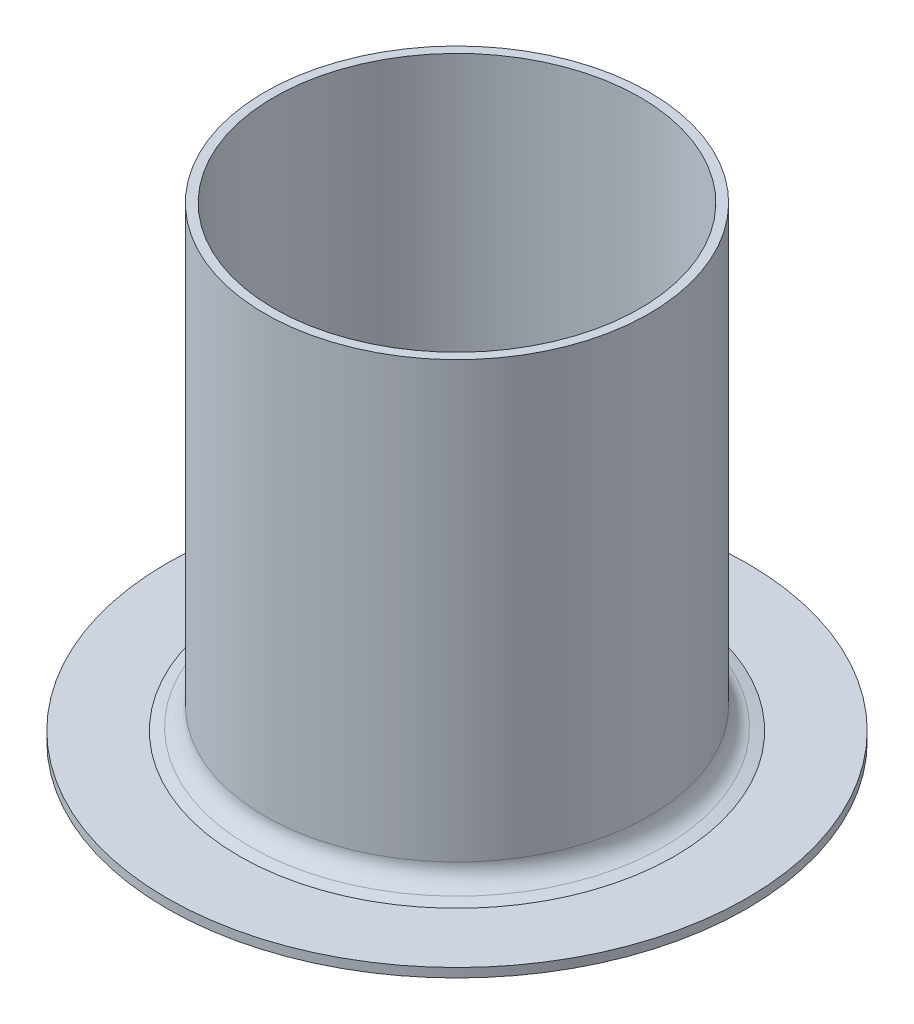
ISO-10303-21;
HEADER;
FILE_DESCRIPTION(('STEP AP214'),'2;1');
FILE_NAME('part.step','',(''),(''),'','','');
FILE_SCHEMA(('AUTOMOTIVE_DESIGN { 1 0 10303 214 1 1 1 1 }'));
ENDSEC;
DATA;
#1=APPLICATION_CONTEXT('core data for automotive mechanical design processes');
#2=APPLICATION_PROTOCOL_DEFINITION('international standard','automotive_design',2000,#1);
#3=PRODUCT_CONTEXT('',#1,'mechanical');
#4=PRODUCT('Part','Part','',(#3));
#5=PRODUCT_RELATED_PRODUCT_CATEGORY('part','',(#4));
#6=PRODUCT_DEFINITION_FORMATION('','',#4);
#7=PRODUCT_DEFINITION_CONTEXT('part definition',#1,'design');
#8=PRODUCT_DEFINITION('design','',#6,#7);
#9=PRODUCT_DEFINITION_SHAPE('','',#8);
#10=(LENGTH_UNIT() NAMED_UNIT(*) SI_UNIT(.MILLI.,.METRE.));
#11=(NAMED_UNIT(*) PLANE_ANGLE_UNIT() SI_UNIT($,.RADIAN.));
#12=(NAMED_UNIT(*) SI_UNIT($,.STERADIAN.) SOLID_ANGLE_UNIT());
#13=UNCERTAINTY_MEASURE_WITH_UNIT(LENGTH_MEASURE(1.E-05),#10,'distance_accuracy_value','');
#14=(GEOMETRIC_REPRESENTATION_CONTEXT(3) GLOBAL_UNCERTAINTY_ASSIGNED_CONTEXT((#13)) GLOBAL_UNIT_ASSIGNED_CONTEXT((#10,
#11,#12)) REPRESENTATION_CONTEXT('',''));
#15=CARTESIAN_POINT('',(0.,0.,0.));
#16=DIRECTION('',(0.,0.,1.));
#17=DIRECTION('',(1.,0.,0.));
#18=AXIS2_PLACEMENT_3D('',#15,#16,#17);
#19=CARTESIAN_POINT('',(0.,1.5875,0.));
#20=DIRECTION('',(0.,-1.,0.));
#21=DIRECTION('',(0.,0.,-1.));
#22=AXIS2_PLACEMENT_3D('',#19,#20,#21);
#23=CONICAL_SURFACE('',#22,38.1,1.30899693899575);
#24=CARTESIAN_POINT('',(0.,2.09208202372315,0.));
#25=DIRECTION('',(0.,-1.,0.));
#26=DIRECTION('',(0.,0.,-1.));
#27=AXIS2_PLACEMENT_3D('',#24,#25,#26);
#28=CIRCLE('',#27,36.2168742508792);
#29=CARTESIAN_POINT('',(0.,2.09208202372315,-36.2168742508792));
#30=VERTEX_POINT('',#29);
#31=EDGE_CURVE('E10',#30,#30,#28,.T.);
#32=ORIENTED_EDGE('',*,*,#31,.T.);
#33=EDGE_LOOP('',(#32));
#34=FACE_BOUND('',#33,.T.);
#35=CARTESIAN_POINT('',(0.,1.5875,0.));
#36=DIRECTION('',(0.,-1.,0.));
#37=DIRECTION('',(0.,0.,-1.));
#38=AXIS2_PLACEMENT_3D('',#35,#36,#37);
#39=CIRCLE('',#38,38.1);
#40=CARTESIAN_POINT('',(0.,1.5875,-38.1));
#41=VERTEX_POINT('',#40);
#42=EDGE_CURVE('E86',#41,#41,#39,.T.);
#43=ORIENTED_EDGE('',*,*,#42,.F.);
#44=EDGE_LOOP('',(#43));
#45=FACE_BOUND('',#44,.T.);
#46=ADVANCED_FACE('F43',(#34,#45),#23,.T.);
#47=CARTESIAN_POINT('',(0.,5.44733251173257,0.));
#48=DIRECTION('',(0.,-1.,0.));
#49=DIRECTION('',(0.,0.,-1.));
#50=AXIS2_PLACEMENT_3D('',#47,#48,#49);
#51=TOROIDAL_SURFACE('',#50,37.1159109095455,3.47361090954545);
#52=CARTESIAN_POINT('',(0.,5.44733251173257,0.));
#53=DIRECTION('',(0.,-1.,0.));
#54=DIRECTION('',(0.,0.,-1.));
#55=AXIS2_PLACEMENT_3D('',#52,#53,#54);
#56=CIRCLE('',#55,33.6423);
#57=CARTESIAN_POINT('',(0.,5.44733251173257,-33.6423));
#58=VERTEX_POINT('',#57);
#59=EDGE_CURVE('E50',#58,#58,#56,.T.);
#60=ORIENTED_EDGE('',*,*,#59,.T.);
#61=EDGE_LOOP('',(#60));
#62=FACE_BOUND('',#61,.T.);
#63=ORIENTED_EDGE('',*,*,#31,.F.);
#64=EDGE_LOOP('',(#63));
#65=FACE_BOUND('',#64,.T.);
#66=ADVANCED_FACE('F94',(#62,#65),#51,.F.);
#67=CARTESIAN_POINT('',(0.,0.,0.));
#68=DIRECTION('',(0.,-1.,0.));
#69=DIRECTION('',(0.,0.,-1.));
#70=AXIS2_PLACEMENT_3D('',#67,#68,#69);
#71=CYLINDRICAL_SURFACE('',#70,33.6423);
#72=CARTESIAN_POINT('',(0.,81.6473325117326,0.));
#73=DIRECTION('',(0.,-1.,0.));
#74=DIRECTION('',(0.,0.,-1.));
#75=AXIS2_PLACEMENT_3D('',#72,#73,#74);
#76=CIRCLE('',#75,33.6423);
#77=CARTESIAN_POINT('',(0.,81.6473325117326,-33.6423));
#78=VERTEX_POINT('',#77);
#79=EDGE_CURVE('E55',#78,#78,#76,.T.);
#80=ORIENTED_EDGE('',*,*,#79,.T.);
#81=EDGE_LOOP('',(#80));
#82=FACE_BOUND('',#81,.T.);
#83=ORIENTED_EDGE('',*,*,#59,.F.);
#84=EDGE_LOOP('',(#83));
#85=FACE_BOUND('',#84,.T.);
#86=ADVANCED_FACE('F98',(#82,#85),#71,.T.);
#87=CARTESIAN_POINT('',(0.,81.6473325117326,0.));
#88=DIRECTION('',(0.,1.,0.));
#89=DIRECTION('',(0.,0.,1.));
#90=AXIS2_PLACEMENT_3D('',#87,#88,#89);
#91=PLANE('',#90);
#92=CARTESIAN_POINT('',(0.,81.6473325117326,0.));
#93=DIRECTION('',(0.,-1.,0.));
#94=DIRECTION('',(0.,0.,-1.));
#95=AXIS2_PLACEMENT_3D('',#92,#93,#94);
#96=CIRCLE('',#95,32.0548);
#97=CARTESIAN_POINT('',(0.,81.6473325117326,-32.0548));
#98=VERTEX_POINT('',#97);
#99=EDGE_CURVE('E60',#98,#98,#96,.T.);
#100=ORIENTED_EDGE('',*,*,#99,.T.);
#101=EDGE_LOOP('',(#100));
#102=FACE_BOUND('',#101,.T.);
#103=ORIENTED_EDGE('',*,*,#79,.F.);
#104=EDGE_LOOP('',(#103));
#105=FACE_BOUND('',#104,.T.);
#106=ADVANCED_FACE('F102',(#102,#105),#91,.T.);
#107=CARTESIAN_POINT('',(0.,0.,0.));
#108=DIRECTION('',(0.,-1.,0.));
#109=DIRECTION('',(0.,0.,-1.));
#110=AXIS2_PLACEMENT_3D('',#107,#108,#109);
#111=CYLINDRICAL_SURFACE('',#110,32.0548);
#112=ORIENTED_EDGE('',*,*,#99,.F.);
#113=EDGE_LOOP('',(#112));
#114=FACE_BOUND('',#113,.T.);
#115=CARTESIAN_POINT('',(0.,5.51782755701772,0.));
#116=DIRECTION('',(0.,-1.,0.));
#117=DIRECTION('',(0.,0.,-1.));
#118=AXIS2_PLACEMENT_3D('',#115,#116,#117);
#119=CIRCLE('',#118,32.0548);
#120=CARTESIAN_POINT('',(0.,5.51782755701772,-32.0548));
#121=VERTEX_POINT('',#120);
#122=EDGE_CURVE('E66',#121,#121,#119,.T.);
#123=ORIENTED_EDGE('',*,*,#122,.T.);
#124=EDGE_LOOP('',(#123));
#125=FACE_BOUND('',#124,.T.);
#126=ADVANCED_FACE('F109',(#114,#125),#111,.F.);
#127=CARTESIAN_POINT('',(0.,5.51782755701772,0.));
#128=DIRECTION('',(0.,-1.,0.));
#129=DIRECTION('',(0.,0.,-1.));
#130=AXIS2_PLACEMENT_3D('',#127,#128,#129);
#131=TOROIDAL_SURFACE('',#130,37.1348,5.08);
#132=ORIENTED_EDGE('',*,*,#122,.F.);
#133=EDGE_LOOP('',(#132));
#134=FACE_BOUND('',#133,.T.);
#135=CARTESIAN_POINT('',(0.,0.610924359469248,0.));
#136=DIRECTION('',(0.,-1.,0.));
#137=DIRECTION('',(0.,0.,-1.));
#138=AXIS2_PLACEMENT_3D('',#135,#136,#137);
#139=CIRCLE('',#138,35.8199992508792);
#140=CARTESIAN_POINT('',(0.,0.610924359469248,-35.8199992508792));
#141=VERTEX_POINT('',#140);
#142=EDGE_CURVE('E70',#141,#141,#139,.T.);
#143=ORIENTED_EDGE('',*,*,#142,.T.);
#144=EDGE_LOOP('',(#143));
#145=FACE_BOUND('',#144,.T.);
#146=ADVANCED_FACE('F113',(#134,#145),#131,.T.);
#147=CARTESIAN_POINT('',(0.,0.,0.));
#148=DIRECTION('',(0.,-1.,0.));
#149=DIRECTION('',(0.,0.,-1.));
#150=AXIS2_PLACEMENT_3D('',#147,#148,#149);
#151=CONICAL_SURFACE('',#150,38.1,1.30899693899575);
#152=ORIENTED_EDGE('',*,*,#142,.F.);
#153=EDGE_LOOP('',(#152));
#154=FACE_BOUND('',#153,.T.);
#155=CARTESIAN_POINT('',(0.,0.,0.));
#156=DIRECTION('',(0.,-1.,0.));
#157=DIRECTION('',(0.,0.,-1.));
#158=AXIS2_PLACEMENT_3D('',#155,#156,#157);
#159=CIRCLE('',#158,38.1);
#160=CARTESIAN_POINT('',(0.,0.,-38.1));
#161=VERTEX_POINT('',#160);
#162=EDGE_CURVE('E74',#161,#161,#159,.T.);
#163=ORIENTED_EDGE('',*,*,#162,.T.);
#164=EDGE_LOOP('',(#163));
#165=FACE_BOUND('',#164,.T.);
#166=ADVANCED_FACE('F117',(#154,#165),#151,.F.);
#167=CARTESIAN_POINT('',(0.,0.,0.));
#168=DIRECTION('',(0.,-1.,0.));
#169=DIRECTION('',(0.,0.,-1.));
#170=AXIS2_PLACEMENT_3D('',#167,#168,#169);
#171=PLANE('',#170);
#172=CARTESIAN_POINT('',(0.,0.,0.));
#173=DIRECTION('',(0.,-1.,0.));
#174=DIRECTION('',(0.,0.,-1.));
#175=AXIS2_PLACEMENT_3D('',#172,#173,#174);
#176=CIRCLE('',#175,50.8);
#177=CARTESIAN_POINT('',(0.,0.,-50.8));
#178=VERTEX_POINT('',#177);
#179=EDGE_CURVE('E78',#178,#178,#176,.T.);
#180=ORIENTED_EDGE('',*,*,#179,.T.);
#181=EDGE_LOOP('',(#180));
#182=FACE_BOUND('',#181,.T.);
#183=ORIENTED_EDGE('',*,*,#162,.F.);
#184=EDGE_LOOP('',(#183));
#185=FACE_BOUND('',#184,.T.);
#186=ADVANCED_FACE('F121',(#182,#185),#171,.T.);
#187=CARTESIAN_POINT('',(0.,0.,0.));
#188=DIRECTION('',(0.,-1.,0.));
#189=DIRECTION('',(0.,0.,-1.));
#190=AXIS2_PLACEMENT_3D('',#187,#188,#189);
#191=CYLINDRICAL_SURFACE('',#190,50.8);
#192=CARTESIAN_POINT('',(0.,1.5875,0.));
#193=DIRECTION('',(0.,-1.,0.));
#194=DIRECTION('',(0.,0.,-1.));
#195=AXIS2_PLACEMENT_3D('',#192,#193,#194);
#196=CIRCLE('',#195,50.8);
#197=CARTESIAN_POINT('',(0.,1.5875,-50.8));
#198=VERTEX_POINT('',#197);
#199=EDGE_CURVE('E82',#198,#198,#196,.T.);
#200=ORIENTED_EDGE('',*,*,#199,.T.);
#201=EDGE_LOOP('',(#200));
#202=FACE_BOUND('',#201,.T.);
#203=ORIENTED_EDGE('',*,*,#179,.F.);
#204=EDGE_LOOP('',(#203));
#205=FACE_BOUND('',#204,.T.);
#206=ADVANCED_FACE('F125',(#202,#205),#191,.T.);
#207=CARTESIAN_POINT('',(0.,1.5875,0.));
#208=DIRECTION('',(0.,-1.,0.));
#209=DIRECTION('',(0.,0.,-1.));
#210=AXIS2_PLACEMENT_3D('',#207,#208,#209);
#211=PLANE('',#210);
#212=ORIENTED_EDGE('',*,*,#199,.F.);
#213=EDGE_LOOP('',(#212));
#214=FACE_BOUND('',#213,.T.);
#215=ORIENTED_EDGE('',*,*,#42,.T.);
#216=EDGE_LOOP('',(#215));
#217=FACE_BOUND('',#216,.T.);
#218=ADVANCED_FACE('F91',(#214,#217),#211,.F.);
#219=CLOSED_SHELL('',(#46,#66,#86,#106,#126,#146,#166,#186,#206,#218));
#220=MANIFOLD_SOLID_BREP('B2',#219);
#221=ADVANCED_BREP_SHAPE_REPRESENTATION('',(#18,#220),#14);
#222=SHAPE_DEFINITION_REPRESENTATION(#9,#221);
ENDSEC;
END-ISO-10303-21;
